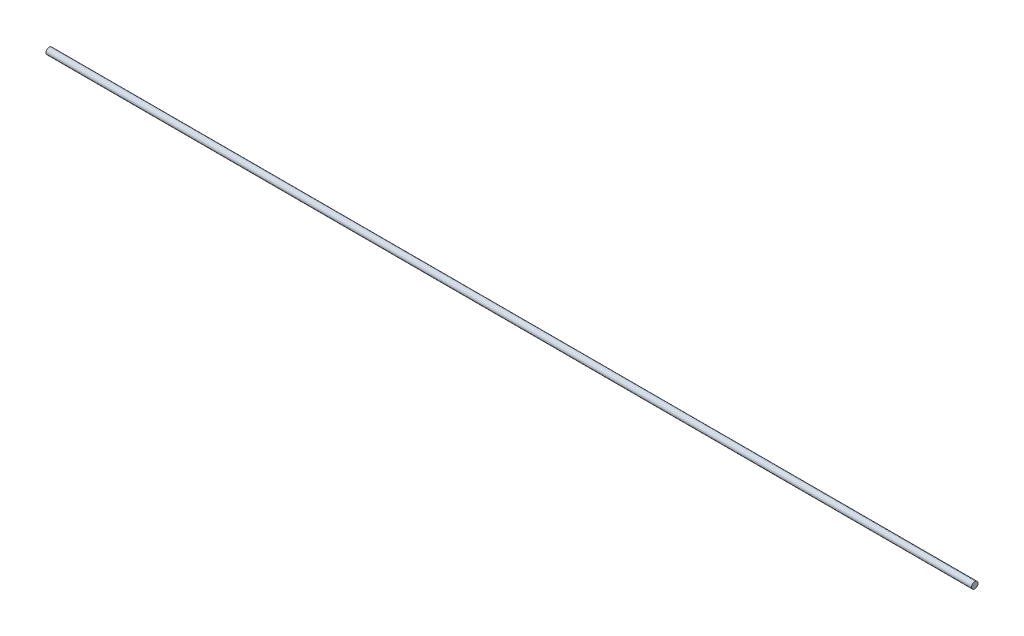
ISO-10303-21;
HEADER;
FILE_DESCRIPTION(('STEP AP214'),'2;1');
FILE_NAME('part.step','',(''),(''),'','','');
FILE_SCHEMA(('AUTOMOTIVE_DESIGN { 1 0 10303 214 1 1 1 1 }'));
ENDSEC;
DATA;
#1=APPLICATION_CONTEXT('core data for automotive mechanical design processes');
#2=APPLICATION_PROTOCOL_DEFINITION('international standard','automotive_design',2000,#1);
#3=PRODUCT_CONTEXT('',#1,'mechanical');
#4=PRODUCT('Part','Part','',(#3));
#5=PRODUCT_RELATED_PRODUCT_CATEGORY('part','',(#4));
#6=PRODUCT_DEFINITION_FORMATION('','',#4);
#7=PRODUCT_DEFINITION_CONTEXT('part definition',#1,'design');
#8=PRODUCT_DEFINITION('design','',#6,#7);
#9=PRODUCT_DEFINITION_SHAPE('','',#8);
#10=(LENGTH_UNIT() NAMED_UNIT(*) SI_UNIT(.MILLI.,.METRE.));
#11=(NAMED_UNIT(*) PLANE_ANGLE_UNIT() SI_UNIT($,.RADIAN.));
#12=(NAMED_UNIT(*) SI_UNIT($,.STERADIAN.) SOLID_ANGLE_UNIT());
#13=UNCERTAINTY_MEASURE_WITH_UNIT(LENGTH_MEASURE(1.E-05),#10,'distance_accuracy_value','');
#14=(GEOMETRIC_REPRESENTATION_CONTEXT(3) GLOBAL_UNCERTAINTY_ASSIGNED_CONTEXT((#13)) GLOBAL_UNIT_ASSIGNED_CONTEXT((#10,
#11,#12)) REPRESENTATION_CONTEXT('',''));
#15=CARTESIAN_POINT('',(0.,0.,0.));
#16=DIRECTION('',(0.,0.,1.));
#17=DIRECTION('',(1.,0.,0.));
#18=AXIS2_PLACEMENT_3D('',#15,#16,#17);
#19=CARTESIAN_POINT('',(145.,0.,0.));
#20=DIRECTION('',(-1.,0.,0.));
#21=DIRECTION('',(0.,0.,1.));
#22=AXIS2_PLACEMENT_3D('',#19,#20,#21);
#23=CYLINDRICAL_SURFACE('',#22,0.5);
#24=CARTESIAN_POINT('',(145.,0.,0.));
#25=DIRECTION('',(1.,0.,0.));
#26=DIRECTION('',(0.,0.,-1.));
#27=AXIS2_PLACEMENT_3D('',#24,#25,#26);
#28=CIRCLE('',#27,0.5);
#29=CARTESIAN_POINT('',(145.,0.,-0.5));
#30=VERTEX_POINT('',#29);
#31=EDGE_CURVE('E10',#30,#30,#28,.T.);
#32=ORIENTED_EDGE('',*,*,#31,.F.);
#33=EDGE_LOOP('',(#32));
#34=FACE_BOUND('',#33,.T.);
#35=CARTESIAN_POINT('',(0.,0.,0.));
#36=DIRECTION('',(1.,0.,0.));
#37=DIRECTION('',(0.,0.,-1.));
#38=AXIS2_PLACEMENT_3D('',#35,#36,#37);
#39=CIRCLE('',#38,0.5);
#40=CARTESIAN_POINT('',(0.,0.,-0.5));
#41=VERTEX_POINT('',#40);
#42=EDGE_CURVE('E35',#41,#41,#39,.T.);
#43=ORIENTED_EDGE('',*,*,#42,.T.);
#44=EDGE_LOOP('',(#43));
#45=FACE_BOUND('',#44,.T.);
#46=ADVANCED_FACE('F32',(#34,#45),#23,.T.);
#47=CARTESIAN_POINT('',(145.,0.,0.));
#48=DIRECTION('',(1.,0.,0.));
#49=DIRECTION('',(0.,0.,-1.));
#50=AXIS2_PLACEMENT_3D('',#47,#48,#49);
#51=PLANE('',#50);
#52=ORIENTED_EDGE('',*,*,#31,.T.);
#53=EDGE_LOOP('',(#52));
#54=FACE_BOUND('',#53,.T.);
#55=ADVANCED_FACE('F47',(#54),#51,.T.);
#56=CARTESIAN_POINT('',(0.,0.,0.));
#57=DIRECTION('',(1.,0.,0.));
#58=DIRECTION('',(0.,0.,-1.));
#59=AXIS2_PLACEMENT_3D('',#56,#57,#58);
#60=PLANE('',#59);
#61=ORIENTED_EDGE('',*,*,#42,.F.);
#62=EDGE_LOOP('',(#61));
#63=FACE_BOUND('',#62,.T.);
#64=ADVANCED_FACE('F45',(#63),#60,.F.);
#65=CLOSED_SHELL('',(#46,#55,#64));
#66=MANIFOLD_SOLID_BREP('B2',#65);
#67=ADVANCED_BREP_SHAPE_REPRESENTATION('',(#18,#66),#14);
#68=SHAPE_DEFINITION_REPRESENTATION(#9,#67);
ENDSEC;
END-ISO-10303-21;
